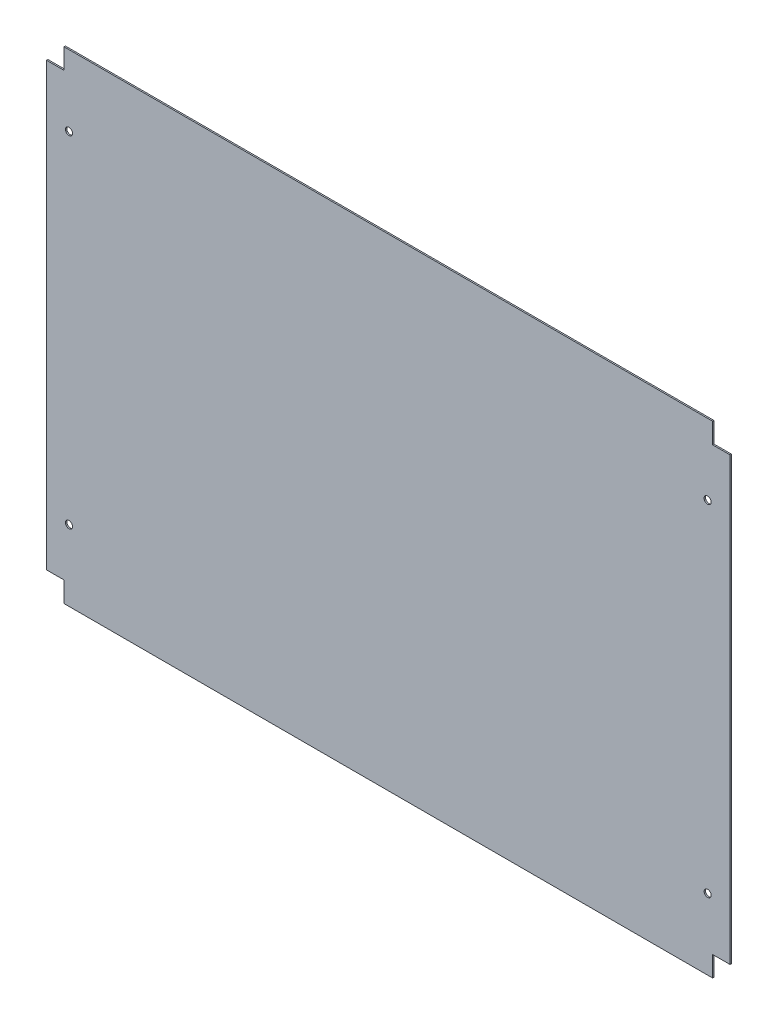
ISO-10303-21;
HEADER;
FILE_DESCRIPTION(('STEP AP214'),'2;1');
FILE_NAME('part.step','',(''),(''),'','','');
FILE_SCHEMA(('AUTOMOTIVE_DESIGN { 1 0 10303 214 1 1 1 1 }'));
ENDSEC;
DATA;
#1=APPLICATION_CONTEXT('core data for automotive mechanical design processes');
#2=APPLICATION_PROTOCOL_DEFINITION('international standard','automotive_design',2000,#1);
#3=PRODUCT_CONTEXT('',#1,'mechanical');
#4=PRODUCT('Part','Part','',(#3));
#5=PRODUCT_RELATED_PRODUCT_CATEGORY('part','',(#4));
#6=PRODUCT_DEFINITION_FORMATION('','',#4);
#7=PRODUCT_DEFINITION_CONTEXT('part definition',#1,'design');
#8=PRODUCT_DEFINITION('design','',#6,#7);
#9=PRODUCT_DEFINITION_SHAPE('','',#8);
#10=(LENGTH_UNIT() NAMED_UNIT(*) SI_UNIT(.MILLI.,.METRE.));
#11=(NAMED_UNIT(*) PLANE_ANGLE_UNIT() SI_UNIT($,.RADIAN.));
#12=(NAMED_UNIT(*) SI_UNIT($,.STERADIAN.) SOLID_ANGLE_UNIT());
#13=UNCERTAINTY_MEASURE_WITH_UNIT(LENGTH_MEASURE(1.E-05),#10,'distance_accuracy_value','');
#14=(GEOMETRIC_REPRESENTATION_CONTEXT(3) GLOBAL_UNCERTAINTY_ASSIGNED_CONTEXT((#13)) GLOBAL_UNIT_ASSIGNED_CONTEXT((#10,
#11,#12)) REPRESENTATION_CONTEXT('',''));
#15=CARTESIAN_POINT('',(0.,0.,0.));
#16=DIRECTION('',(0.,0.,1.));
#17=DIRECTION('',(1.,0.,0.));
#18=AXIS2_PLACEMENT_3D('',#15,#16,#17);
#19=CARTESIAN_POINT('',(0.,0.,-1.524));
#20=DIRECTION('',(0.,0.,-1.));
#21=DIRECTION('',(-1.,0.,0.));
#22=AXIS2_PLACEMENT_3D('',#19,#20,#21);
#23=PLANE('',#22);
#24=CARTESIAN_POINT('',(-357.251,-190.5,-1.524));
#25=DIRECTION('',(0.,0.,-1.));
#26=DIRECTION('',(-1.,0.,0.));
#27=AXIS2_PLACEMENT_3D('',#24,#25,#26);
#28=CIRCLE('',#27,3.9624);
#29=CARTESIAN_POINT('',(-361.2134,-190.5,-1.524));
#30=VERTEX_POINT('',#29);
#31=EDGE_CURVE('E380',#30,#30,#28,.T.);
#32=ORIENTED_EDGE('',*,*,#31,.F.);
#33=EDGE_LOOP('',(#32));
#34=FACE_BOUND('',#33,.T.);
#35=CARTESIAN_POINT('',(357.251,190.5,-1.524));
#36=DIRECTION('',(0.,0.,-1.));
#37=DIRECTION('',(-1.,0.,0.));
#38=AXIS2_PLACEMENT_3D('',#35,#36,#37);
#39=CIRCLE('',#38,3.9624);
#40=CARTESIAN_POINT('',(353.2886,190.5,-1.524));
#41=VERTEX_POINT('',#40);
#42=EDGE_CURVE('E376',#41,#41,#39,.T.);
#43=ORIENTED_EDGE('',*,*,#42,.F.);
#44=EDGE_LOOP('',(#43));
#45=FACE_BOUND('',#44,.T.);
#46=CARTESIAN_POINT('',(357.251,-190.5,-1.524));
#47=DIRECTION('',(0.,0.,-1.));
#48=DIRECTION('',(-1.,0.,0.));
#49=AXIS2_PLACEMENT_3D('',#46,#47,#48);
#50=CIRCLE('',#49,3.9624);
#51=CARTESIAN_POINT('',(353.2886,-190.5,-1.524));
#52=VERTEX_POINT('',#51);
#53=EDGE_CURVE('E372',#52,#52,#50,.T.);
#54=ORIENTED_EDGE('',*,*,#53,.F.);
#55=EDGE_LOOP('',(#54));
#56=FACE_BOUND('',#55,.T.);
#57=CARTESIAN_POINT('',(-357.251,190.5,-1.524));
#58=DIRECTION('',(0.,0.,-1.));
#59=DIRECTION('',(-1.,0.,0.));
#60=AXIS2_PLACEMENT_3D('',#57,#58,#59);
#61=CIRCLE('',#60,3.9624);
#62=CARTESIAN_POINT('',(-361.2134,190.5,-1.524));
#63=VERTEX_POINT('',#62);
#64=EDGE_CURVE('E368',#63,#63,#61,.T.);
#65=ORIENTED_EDGE('',*,*,#64,.F.);
#66=EDGE_LOOP('',(#65));
#67=FACE_BOUND('',#66,.T.);
#68=DIRECTION('',(0.,-1.,0.));
#69=VECTOR('',#68,1.);
#70=CARTESIAN_POINT('',(-362.6866,247.0404,-1.52400000000009));
#71=LINE('',#70,#69);
#72=CARTESIAN_POINT('',(-362.6866,247.0404,-1.524));
#73=VERTEX_POINT('',#72);
#74=CARTESIAN_POINT('',(-362.6866,246.888,-1.524));
#75=VERTEX_POINT('',#74);
#76=EDGE_CURVE('E150',#73,#75,#71,.T.);
#77=ORIENTED_EDGE('',*,*,#76,.F.);
#78=DIRECTION('',(1.,0.,0.));
#79=VECTOR('',#78,1.);
#80=CARTESIAN_POINT('',(-365.887,247.0404,-1.52400000000009));
#81=LINE('',#80,#79);
#82=CARTESIAN_POINT('',(-362.7628,247.0404,-1.524));
#83=VERTEX_POINT('',#82);
#84=EDGE_CURVE('E385',#83,#73,#81,.T.);
#85=ORIENTED_EDGE('',*,*,#84,.F.);
#86=DIRECTION('',(0.,-1.,0.));
#87=VECTOR('',#86,1.);
#88=CARTESIAN_POINT('',(-362.7628,0.,-1.524));
#89=LINE('',#88,#87);
#90=CARTESIAN_POINT('',(-362.7628,269.734962531012,-1.52399999999991));
#91=VERTEX_POINT('',#90);
#92=EDGE_CURVE('E478',#91,#83,#89,.T.);
#93=ORIENTED_EDGE('',*,*,#92,.F.);
#94=DIRECTION('',(-1.,0.,0.));
#95=VECTOR('',#94,1.);
#96=CARTESIAN_POINT('',(0.,269.734962531012,-1.52399999999991));
#97=LINE('',#96,#95);
#98=CARTESIAN_POINT('',(362.7628,269.734962531012,-1.52399999999991));
#99=VERTEX_POINT('',#98);
#100=EDGE_CURVE('E294',#91,#99,#97,.F.);
#101=ORIENTED_EDGE('',*,*,#100,.T.);
#102=DIRECTION('',(0.,1.,0.));
#103=VECTOR('',#102,1.);
#104=CARTESIAN_POINT('',(362.7628,0.,-1.524));
#105=LINE('',#104,#103);
#106=CARTESIAN_POINT('',(362.7628,247.0404,-1.52399999999998));
#107=VERTEX_POINT('',#106);
#108=EDGE_CURVE('E289',#107,#99,#105,.T.);
#109=ORIENTED_EDGE('',*,*,#108,.F.);
#110=DIRECTION('',(1.,0.,0.));
#111=VECTOR('',#110,1.);
#112=CARTESIAN_POINT('',(362.6866,247.0404,-1.52399999999998));
#113=LINE('',#112,#111);
#114=CARTESIAN_POINT('',(362.6866,247.0404,-1.52399999999998));
#115=VERTEX_POINT('',#114);
#116=EDGE_CURVE('E436',#115,#107,#113,.T.);
#117=ORIENTED_EDGE('',*,*,#116,.F.);
#118=DIRECTION('',(0.,1.,0.));
#119=VECTOR('',#118,1.);
#120=CARTESIAN_POINT('',(362.6866,246.888,-1.52399999999998));
#121=LINE('',#120,#119);
#122=CARTESIAN_POINT('',(362.6866,246.888,-1.52399999999998));
#123=VERTEX_POINT('',#122);
#124=EDGE_CURVE('E430',#123,#115,#121,.T.);
#125=ORIENTED_EDGE('',*,*,#124,.F.);
#126=DIRECTION('',(-1.,0.,0.));
#127=VECTOR('',#126,1.);
#128=CARTESIAN_POINT('',(0.,246.888,-1.524));
#129=LINE('',#128,#127);
#130=CARTESIAN_POINT('',(382.383962531012,246.888,-1.52399999999991));
#131=VERTEX_POINT('',#130);
#132=EDGE_CURVE('E496',#131,#123,#129,.T.);
#133=ORIENTED_EDGE('',*,*,#132,.F.);
#134=DIRECTION('',(0.,-1.,0.));
#135=VECTOR('',#134,1.);
#136=CARTESIAN_POINT('',(382.383962531012,0.,-1.52399999999986));
#137=LINE('',#136,#135);
#138=CARTESIAN_POINT('',(382.383962531012,-246.888,-1.5239999999998));
#139=VERTEX_POINT('',#138);
#140=EDGE_CURVE('E310',#131,#139,#137,.T.);
#141=ORIENTED_EDGE('',*,*,#140,.T.);
#142=DIRECTION('',(1.,0.,0.));
#143=VECTOR('',#142,1.);
#144=CARTESIAN_POINT('',(0.,-246.888,-1.524));
#145=LINE('',#144,#143);
#146=CARTESIAN_POINT('',(362.6866,-246.888,-1.524));
#147=VERTEX_POINT('',#146);
#148=EDGE_CURVE('E482',#147,#139,#145,.T.);
#149=ORIENTED_EDGE('',*,*,#148,.F.);
#150=DIRECTION('',(0.,1.,0.));
#151=VECTOR('',#150,1.);
#152=CARTESIAN_POINT('',(362.6866,-247.0404,-1.52399999999991));
#153=LINE('',#152,#151);
#154=CARTESIAN_POINT('',(362.6866,-247.0404,-1.524));
#155=VERTEX_POINT('',#154);
#156=EDGE_CURVE('E425',#155,#147,#153,.T.);
#157=ORIENTED_EDGE('',*,*,#156,.F.);
#158=DIRECTION('',(-1.,0.,0.));
#159=VECTOR('',#158,1.);
#160=CARTESIAN_POINT('',(365.887,-247.0404,-1.52399999999991));
#161=LINE('',#160,#159);
#162=CARTESIAN_POINT('',(362.7628,-247.0404,-1.524));
#163=VERTEX_POINT('',#162);
#164=EDGE_CURVE('E420',#163,#155,#161,.T.);
#165=ORIENTED_EDGE('',*,*,#164,.F.);
#166=DIRECTION('',(0.,1.,0.));
#167=VECTOR('',#166,1.);
#168=CARTESIAN_POINT('',(362.7628,0.,-1.524));
#169=LINE('',#168,#167);
#170=CARTESIAN_POINT('',(362.7628,-269.734962531012,-1.52399999999991));
#171=VERTEX_POINT('',#170);
#172=EDGE_CURVE('E485',#171,#163,#169,.T.);
#173=ORIENTED_EDGE('',*,*,#172,.F.);
#174=DIRECTION('',(-1.,0.,0.));
#175=VECTOR('',#174,1.);
#176=CARTESIAN_POINT('',(0.,-269.734962531012,-1.52399999999991));
#177=LINE('',#176,#175);
#178=CARTESIAN_POINT('',(-362.7628,-269.734962531012,-1.52399999999991));
#179=VERTEX_POINT('',#178);
#180=EDGE_CURVE('E327',#171,#179,#177,.T.);
#181=ORIENTED_EDGE('',*,*,#180,.T.);
#182=DIRECTION('',(0.,-1.,0.));
#183=VECTOR('',#182,1.);
#184=CARTESIAN_POINT('',(-362.762800000002,-3.17124104753935E-12,-1.524));
#185=LINE('',#184,#183);
#186=CARTESIAN_POINT('',(-362.7628,-247.0404,-1.52400000000002));
#187=VERTEX_POINT('',#186);
#188=EDGE_CURVE('E488',#187,#179,#185,.T.);
#189=ORIENTED_EDGE('',*,*,#188,.F.);
#190=DIRECTION('',(-1.,0.,0.));
#191=VECTOR('',#190,1.);
#192=CARTESIAN_POINT('',(-362.6866,-247.0404,-1.52400000000002));
#193=LINE('',#192,#191);
#194=CARTESIAN_POINT('',(-362.6866,-247.0404,-1.52400000000002));
#195=VERTEX_POINT('',#194);
#196=EDGE_CURVE('E398',#195,#187,#193,.T.);
#197=ORIENTED_EDGE('',*,*,#196,.F.);
#198=DIRECTION('',(0.,-1.,0.));
#199=VECTOR('',#198,1.);
#200=CARTESIAN_POINT('',(-362.6866,-246.888,-1.52400000000002));
#201=LINE('',#200,#199);
#202=CARTESIAN_POINT('',(-362.6866,-246.888,-1.52400000000002));
#203=VERTEX_POINT('',#202);
#204=EDGE_CURVE('E392',#203,#195,#201,.T.);
#205=ORIENTED_EDGE('',*,*,#204,.F.);
#206=DIRECTION('',(1.,0.,0.));
#207=VECTOR('',#206,1.);
#208=CARTESIAN_POINT('',(0.,-246.888,-1.524));
#209=LINE('',#208,#207);
#210=CARTESIAN_POINT('',(-382.383962531012,-246.888,-1.52399999999991));
#211=VERTEX_POINT('',#210);
#212=EDGE_CURVE('E491',#211,#203,#209,.T.);
#213=ORIENTED_EDGE('',*,*,#212,.F.);
#214=DIRECTION('',(0.,1.,0.));
#215=VECTOR('',#214,1.);
#216=CARTESIAN_POINT('',(-382.383962531012,0.,-1.52399999999991));
#217=LINE('',#216,#215);
#218=CARTESIAN_POINT('',(-382.383962531012,246.888,-1.52399999999991));
#219=VERTEX_POINT('',#218);
#220=EDGE_CURVE('E343',#211,#219,#217,.T.);
#221=ORIENTED_EDGE('',*,*,#220,.T.);
#222=DIRECTION('',(-1.,0.,0.));
#223=VECTOR('',#222,1.);
#224=CARTESIAN_POINT('',(0.,246.888,-1.524));
#225=LINE('',#224,#223);
#226=EDGE_CURVE('E155',#75,#219,#225,.T.);
#227=ORIENTED_EDGE('',*,*,#226,.F.);
#228=EDGE_LOOP('',(#77,#85,#93,#101,#109,#117,#125,#133,#141,#149,#157,#165,#173,#181,#189,#197,
#205,#213,#221,#227));
#229=FACE_BOUND('',#228,.T.);
#230=ADVANCED_FACE('F134',(#34,#45,#56,#67,#229),#23,.T.);
#231=CARTESIAN_POINT('',(0.,0.,0.));
#232=DIRECTION('',(0.,0.,-1.));
#233=DIRECTION('',(-1.,0.,0.));
#234=AXIS2_PLACEMENT_3D('',#231,#232,#233);
#235=PLANE('',#234);
#236=CARTESIAN_POINT('',(-357.251,-190.5,0.));
#237=DIRECTION('',(0.,0.,1.));
#238=DIRECTION('',(1.,0.,0.));
#239=AXIS2_PLACEMENT_3D('',#236,#237,#238);
#240=CIRCLE('',#239,3.9624);
#241=CARTESIAN_POINT('',(-353.2886,-190.5,0.));
#242=VERTEX_POINT('',#241);
#243=EDGE_CURVE('E357',#242,#242,#240,.T.);
#244=ORIENTED_EDGE('',*,*,#243,.F.);
#245=EDGE_LOOP('',(#244));
#246=FACE_BOUND('',#245,.T.);
#247=CARTESIAN_POINT('',(357.251,190.5,0.));
#248=DIRECTION('',(0.,0.,1.));
#249=DIRECTION('',(1.,0.,0.));
#250=AXIS2_PLACEMENT_3D('',#247,#248,#249);
#251=CIRCLE('',#250,3.9624);
#252=CARTESIAN_POINT('',(361.2134,190.5,0.));
#253=VERTEX_POINT('',#252);
#254=EDGE_CURVE('E356',#253,#253,#251,.T.);
#255=ORIENTED_EDGE('',*,*,#254,.F.);
#256=EDGE_LOOP('',(#255));
#257=FACE_BOUND('',#256,.T.);
#258=CARTESIAN_POINT('',(357.251,-190.5,0.));
#259=DIRECTION('',(0.,0.,1.));
#260=DIRECTION('',(1.,0.,0.));
#261=AXIS2_PLACEMENT_3D('',#258,#259,#260);
#262=CIRCLE('',#261,3.9624);
#263=CARTESIAN_POINT('',(361.2134,-190.5,0.));
#264=VERTEX_POINT('',#263);
#265=EDGE_CURVE('E342',#264,#264,#262,.T.);
#266=ORIENTED_EDGE('',*,*,#265,.F.);
#267=EDGE_LOOP('',(#266));
#268=FACE_BOUND('',#267,.T.);
#269=CARTESIAN_POINT('',(-357.251,190.5,0.));
#270=DIRECTION('',(0.,0.,1.));
#271=DIRECTION('',(1.,0.,0.));
#272=AXIS2_PLACEMENT_3D('',#269,#270,#271);
#273=CIRCLE('',#272,3.9624);
#274=CARTESIAN_POINT('',(-353.2886,190.5,0.));
#275=VERTEX_POINT('',#274);
#276=EDGE_CURVE('E361',#275,#275,#273,.T.);
#277=ORIENTED_EDGE('',*,*,#276,.F.);
#278=EDGE_LOOP('',(#277));
#279=FACE_BOUND('',#278,.T.);
#280=DIRECTION('',(-1.,0.,0.));
#281=VECTOR('',#280,1.);
#282=CARTESIAN_POINT('',(0.,247.0404,0.));
#283=LINE('',#282,#281);
#284=CARTESIAN_POINT('',(-362.6866,247.0404,0.));
#285=VERTEX_POINT('',#284);
#286=CARTESIAN_POINT('',(-362.7628,247.0404,0.));
#287=VERTEX_POINT('',#286);
#288=EDGE_CURVE('E388',#285,#287,#283,.T.);
#289=ORIENTED_EDGE('',*,*,#288,.F.);
#290=DIRECTION('',(0.,1.,0.));
#291=VECTOR('',#290,1.);
#292=CARTESIAN_POINT('',(-362.6866,0.,0.));
#293=LINE('',#292,#291);
#294=CARTESIAN_POINT('',(-362.6866,246.888,0.));
#295=VERTEX_POINT('',#294);
#296=EDGE_CURVE('E13',#295,#285,#293,.T.);
#297=ORIENTED_EDGE('',*,*,#296,.F.);
#298=DIRECTION('',(1.,0.,0.));
#299=VECTOR('',#298,1.);
#300=CARTESIAN_POINT('',(-365.887,246.888,0.));
#301=LINE('',#300,#299);
#302=CARTESIAN_POINT('',(-382.383962531012,246.888,1.11022302462516E-13));
#303=VERTEX_POINT('',#302);
#304=EDGE_CURVE('E282',#303,#295,#301,.T.);
#305=ORIENTED_EDGE('',*,*,#304,.F.);
#306=DIRECTION('',(0.,-1.,0.));
#307=VECTOR('',#306,1.);
#308=CARTESIAN_POINT('',(-382.383962531012,-246.888,1.11022302462516E-13));
#309=LINE('',#308,#307);
#310=CARTESIAN_POINT('',(-382.383962531012,-246.888,1.11022302462516E-13));
#311=VERTEX_POINT('',#310);
#312=EDGE_CURVE('E326',#311,#303,#309,.F.);
#313=ORIENTED_EDGE('',*,*,#312,.F.);
#314=DIRECTION('',(-1.,0.,0.));
#315=VECTOR('',#314,1.);
#316=CARTESIAN_POINT('',(-365.887,-246.888,0.));
#317=LINE('',#316,#315);
#318=CARTESIAN_POINT('',(-362.6866,-246.888,0.));
#319=VERTEX_POINT('',#318);
#320=EDGE_CURVE('E462',#319,#311,#317,.T.);
#321=ORIENTED_EDGE('',*,*,#320,.F.);
#322=DIRECTION('',(0.,1.,0.));
#323=VECTOR('',#322,1.);
#324=CARTESIAN_POINT('',(-362.6866,0.,0.));
#325=LINE('',#324,#323);
#326=CARTESIAN_POINT('',(-362.6866,-247.0404,0.));
#327=VERTEX_POINT('',#326);
#328=EDGE_CURVE('E143',#327,#319,#325,.T.);
#329=ORIENTED_EDGE('',*,*,#328,.F.);
#330=DIRECTION('',(1.,0.,0.));
#331=VECTOR('',#330,1.);
#332=CARTESIAN_POINT('',(0.,-247.0404,0.));
#333=LINE('',#332,#331);
#334=CARTESIAN_POINT('',(-362.7628,-247.0404,0.));
#335=VERTEX_POINT('',#334);
#336=EDGE_CURVE('E416',#335,#327,#333,.T.);
#337=ORIENTED_EDGE('',*,*,#336,.F.);
#338=DIRECTION('',(0.,1.,0.));
#339=VECTOR('',#338,1.);
#340=CARTESIAN_POINT('',(-362.7628,-253.238,0.));
#341=LINE('',#340,#339);
#342=CARTESIAN_POINT('',(-362.7628,-269.734962531012,1.11022302462516E-13));
#343=VERTEX_POINT('',#342);
#344=EDGE_CURVE('E464',#343,#335,#341,.T.);
#345=ORIENTED_EDGE('',*,*,#344,.F.);
#346=DIRECTION('',(1.,0.,0.));
#347=VECTOR('',#346,1.);
#348=CARTESIAN_POINT('',(362.7628,-269.734962531012,1.11022302462516E-13));
#349=LINE('',#348,#347);
#350=CARTESIAN_POINT('',(362.7628,-269.734962531012,1.11022302462516E-13));
#351=VERTEX_POINT('',#350);
#352=EDGE_CURVE('E309',#351,#343,#349,.F.);
#353=ORIENTED_EDGE('',*,*,#352,.F.);
#354=DIRECTION('',(0.,-1.,0.));
#355=VECTOR('',#354,1.);
#356=CARTESIAN_POINT('',(362.7628,-253.238,0.));
#357=LINE('',#356,#355);
#358=CARTESIAN_POINT('',(362.7628,-247.0404,0.));
#359=VERTEX_POINT('',#358);
#360=EDGE_CURVE('E456',#359,#351,#357,.T.);
#361=ORIENTED_EDGE('',*,*,#360,.F.);
#362=DIRECTION('',(1.,0.,0.));
#363=VECTOR('',#362,1.);
#364=CARTESIAN_POINT('',(0.,-247.0404,0.));
#365=LINE('',#364,#363);
#366=CARTESIAN_POINT('',(362.6866,-247.0404,0.));
#367=VERTEX_POINT('',#366);
#368=EDGE_CURVE('E424',#367,#359,#365,.T.);
#369=ORIENTED_EDGE('',*,*,#368,.F.);
#370=DIRECTION('',(0.,-1.,0.));
#371=VECTOR('',#370,1.);
#372=CARTESIAN_POINT('',(362.6866,0.,0.));
#373=LINE('',#372,#371);
#374=CARTESIAN_POINT('',(362.6866,-246.888,0.));
#375=VERTEX_POINT('',#374);
#376=EDGE_CURVE('E510',#375,#367,#373,.T.);
#377=ORIENTED_EDGE('',*,*,#376,.F.);
#378=DIRECTION('',(-1.,0.,0.));
#379=VECTOR('',#378,1.);
#380=CARTESIAN_POINT('',(365.887,-246.888,0.));
#381=LINE('',#380,#379);
#382=CARTESIAN_POINT('',(382.383962531012,-246.888,2.77555756156289E-13));
#383=VERTEX_POINT('',#382);
#384=EDGE_CURVE('E459',#383,#375,#381,.T.);
#385=ORIENTED_EDGE('',*,*,#384,.F.);
#386=DIRECTION('',(0.,1.,0.));
#387=VECTOR('',#386,1.);
#388=CARTESIAN_POINT('',(382.383962531012,246.888,1.11022302462516E-13));
#389=LINE('',#388,#387);
#390=CARTESIAN_POINT('',(382.383962531012,246.888,1.11022302462516E-13));
#391=VERTEX_POINT('',#390);
#392=EDGE_CURVE('E318',#391,#383,#389,.F.);
#393=ORIENTED_EDGE('',*,*,#392,.F.);
#394=DIRECTION('',(1.,0.,0.));
#395=VECTOR('',#394,1.);
#396=CARTESIAN_POINT('',(365.887,246.888,0.));
#397=LINE('',#396,#395);
#398=CARTESIAN_POINT('',(362.6866,246.888,0.));
#399=VERTEX_POINT('',#398);
#400=EDGE_CURVE('E283',#399,#391,#397,.T.);
#401=ORIENTED_EDGE('',*,*,#400,.F.);
#402=DIRECTION('',(0.,-1.,0.));
#403=VECTOR('',#402,1.);
#404=CARTESIAN_POINT('',(362.6866,0.,0.));
#405=LINE('',#404,#403);
#406=CARTESIAN_POINT('',(362.6866,247.0404,0.));
#407=VERTEX_POINT('',#406);
#408=EDGE_CURVE('E506',#407,#399,#405,.T.);
#409=ORIENTED_EDGE('',*,*,#408,.F.);
#410=DIRECTION('',(-1.,0.,0.));
#411=VECTOR('',#410,1.);
#412=CARTESIAN_POINT('',(0.,247.0404,0.));
#413=LINE('',#412,#411);
#414=CARTESIAN_POINT('',(362.7628,247.0404,0.));
#415=VERTEX_POINT('',#414);
#416=EDGE_CURVE('E278',#415,#407,#413,.T.);
#417=ORIENTED_EDGE('',*,*,#416,.F.);
#418=DIRECTION('',(0.,-1.,0.));
#419=VECTOR('',#418,1.);
#420=CARTESIAN_POINT('',(362.7628,253.238,0.));
#421=LINE('',#420,#419);
#422=CARTESIAN_POINT('',(362.7628,269.734962531012,1.11022302462516E-13));
#423=VERTEX_POINT('',#422);
#424=EDGE_CURVE('E272',#423,#415,#421,.T.);
#425=ORIENTED_EDGE('',*,*,#424,.F.);
#426=DIRECTION('',(1.,0.,0.));
#427=VECTOR('',#426,1.);
#428=CARTESIAN_POINT('',(362.7628,269.734962531012,1.11022302462516E-13));
#429=LINE('',#428,#427);
#430=CARTESIAN_POINT('',(-362.7628,269.734962531012,1.11022302462516E-13));
#431=VERTEX_POINT('',#430);
#432=EDGE_CURVE('E276',#431,#423,#429,.T.);
#433=ORIENTED_EDGE('',*,*,#432,.F.);
#434=DIRECTION('',(0.,1.,0.));
#435=VECTOR('',#434,1.);
#436=CARTESIAN_POINT('',(-362.7628,253.238,0.));
#437=LINE('',#436,#435);
#438=EDGE_CURVE('E473',#287,#431,#437,.T.);
#439=ORIENTED_EDGE('',*,*,#438,.F.);
#440=EDGE_LOOP('',(#289,#297,#305,#313,#321,#329,#337,#345,#353,#361,#369,#377,#385,#393,#401,
#409,#417,#425,#433,#439));
#441=FACE_BOUND('',#440,.T.);
#442=ADVANCED_FACE('F136',(#246,#257,#268,#279,#441),#235,.F.);
#443=CARTESIAN_POINT('',(-362.7628,-253.238,-2.54));
#444=DIRECTION('',(1.,0.,0.));
#445=DIRECTION('',(0.,1.,0.));
#446=AXIS2_PLACEMENT_3D('',#443,#444,#445);
#447=PLANE('',#446);
#448=DIRECTION('',(0.,0.,1.));
#449=VECTOR('',#448,1.);
#450=CARTESIAN_POINT('',(-362.7628,-247.0404,-2.54));
#451=LINE('',#450,#449);
#452=EDGE_CURVE('E518',#187,#335,#451,.T.);
#453=ORIENTED_EDGE('',*,*,#452,.F.);
#454=ORIENTED_EDGE('',*,*,#188,.T.);
#455=DIRECTION('',(0.,0.,-1.));
#456=VECTOR('',#455,1.);
#457=CARTESIAN_POINT('',(-362.7628,-269.734962531012,1.11022302462516E-13));
#458=LINE('',#457,#456);
#459=EDGE_CURVE('E331',#343,#179,#458,.T.);
#460=ORIENTED_EDGE('',*,*,#459,.F.);
#461=ORIENTED_EDGE('',*,*,#344,.T.);
#462=EDGE_LOOP('',(#453,#454,#460,#461));
#463=FACE_BOUND('',#462,.T.);
#464=ADVANCED_FACE('F539',(#463),#447,.F.);
#465=CARTESIAN_POINT('',(-362.7628,253.238,-2.54));
#466=DIRECTION('',(1.,0.,0.));
#467=DIRECTION('',(0.,0.,-1.));
#468=AXIS2_PLACEMENT_3D('',#465,#466,#467);
#469=PLANE('',#468);
#470=DIRECTION('',(0.,0.,-1.));
#471=VECTOR('',#470,1.);
#472=CARTESIAN_POINT('',(-362.7628,247.0404,-2.54));
#473=LINE('',#472,#471);
#474=EDGE_CURVE('E514',#287,#83,#473,.T.);
#475=ORIENTED_EDGE('',*,*,#474,.F.);
#476=ORIENTED_EDGE('',*,*,#438,.T.);
#477=DIRECTION('',(0.,0.,-1.));
#478=VECTOR('',#477,1.);
#479=CARTESIAN_POINT('',(-362.7628,269.734962531012,1.11022302462516E-13));
#480=LINE('',#479,#478);
#481=EDGE_CURVE('E299',#431,#91,#480,.T.);
#482=ORIENTED_EDGE('',*,*,#481,.T.);
#483=ORIENTED_EDGE('',*,*,#92,.T.);
#484=EDGE_LOOP('',(#475,#476,#482,#483));
#485=FACE_BOUND('',#484,.T.);
#486=ADVANCED_FACE('F595',(#485),#469,.F.);
#487=CARTESIAN_POINT('',(-365.887,246.888,-2.54));
#488=DIRECTION('',(0.,-1.,0.));
#489=DIRECTION('',(0.,0.,-1.));
#490=AXIS2_PLACEMENT_3D('',#487,#488,#489);
#491=PLANE('',#490);
#492=ORIENTED_EDGE('',*,*,#226,.T.);
#493=DIRECTION('',(0.,0.,-1.));
#494=VECTOR('',#493,1.);
#495=CARTESIAN_POINT('',(-382.383962531012,246.888,1.11022302462516E-13));
#496=LINE('',#495,#494);
#497=EDGE_CURVE('E346',#303,#219,#496,.T.);
#498=ORIENTED_EDGE('',*,*,#497,.F.);
#499=ORIENTED_EDGE('',*,*,#304,.T.);
#500=DIRECTION('',(0.,0.,1.));
#501=VECTOR('',#500,1.);
#502=CARTESIAN_POINT('',(-362.6866,246.888,-1.52400000000009));
#503=LINE('',#502,#501);
#504=EDGE_CURVE('E396',#75,#295,#503,.T.);
#505=ORIENTED_EDGE('',*,*,#504,.F.);
#506=EDGE_LOOP('',(#492,#498,#499,#505));
#507=FACE_BOUND('',#506,.T.);
#508=ADVANCED_FACE('F592',(#507),#491,.F.);
#509=CARTESIAN_POINT('',(-365.887,-246.888,-2.54));
#510=DIRECTION('',(0.,1.,0.));
#511=DIRECTION('',(0.,0.,1.));
#512=AXIS2_PLACEMENT_3D('',#509,#510,#511);
#513=PLANE('',#512);
#514=ORIENTED_EDGE('',*,*,#320,.T.);
#515=DIRECTION('',(0.,0.,-1.));
#516=VECTOR('',#515,1.);
#517=CARTESIAN_POINT('',(-382.383962531012,-246.888,1.11022302462516E-13));
#518=LINE('',#517,#516);
#519=EDGE_CURVE('E338',#311,#211,#518,.T.);
#520=ORIENTED_EDGE('',*,*,#519,.T.);
#521=ORIENTED_EDGE('',*,*,#212,.T.);
#522=DIRECTION('',(0.,0.,1.));
#523=VECTOR('',#522,1.);
#524=CARTESIAN_POINT('',(-362.6866,-246.888,-1.52400000000002));
#525=LINE('',#524,#523);
#526=EDGE_CURVE('E397',#203,#319,#525,.T.);
#527=ORIENTED_EDGE('',*,*,#526,.T.);
#528=EDGE_LOOP('',(#514,#520,#521,#527));
#529=FACE_BOUND('',#528,.T.);
#530=ADVANCED_FACE('F530',(#529),#513,.F.);
#531=CARTESIAN_POINT('',(362.7628,-253.238,-2.54));
#532=DIRECTION('',(-1.,0.,0.));
#533=DIRECTION('',(0.,0.,1.));
#534=AXIS2_PLACEMENT_3D('',#531,#532,#533);
#535=PLANE('',#534);
#536=ORIENTED_EDGE('',*,*,#360,.T.);
#537=DIRECTION('',(0.,0.,-1.));
#538=VECTOR('',#537,1.);
#539=CARTESIAN_POINT('',(362.7628,-269.734962531012,1.11022302462516E-13));
#540=LINE('',#539,#538);
#541=EDGE_CURVE('E322',#351,#171,#540,.T.);
#542=ORIENTED_EDGE('',*,*,#541,.T.);
#543=ORIENTED_EDGE('',*,*,#172,.T.);
#544=DIRECTION('',(0.,0.,-1.));
#545=VECTOR('',#544,1.);
#546=CARTESIAN_POINT('',(362.7628,-247.0404,-2.54));
#547=LINE('',#546,#545);
#548=EDGE_CURVE('E499',#359,#163,#547,.T.);
#549=ORIENTED_EDGE('',*,*,#548,.F.);
#550=EDGE_LOOP('',(#536,#542,#543,#549));
#551=FACE_BOUND('',#550,.T.);
#552=ADVANCED_FACE('F548',(#551),#535,.F.);
#553=CARTESIAN_POINT('',(362.7628,253.238,-2.54));
#554=DIRECTION('',(-1.,0.,0.));
#555=DIRECTION('',(0.,0.,1.));
#556=AXIS2_PLACEMENT_3D('',#553,#554,#555);
#557=PLANE('',#556);
#558=DIRECTION('',(0.,0.,1.));
#559=VECTOR('',#558,1.);
#560=CARTESIAN_POINT('',(362.7628,247.0404,-2.54));
#561=LINE('',#560,#559);
#562=EDGE_CURVE('E503',#107,#415,#561,.T.);
#563=ORIENTED_EDGE('',*,*,#562,.F.);
#564=ORIENTED_EDGE('',*,*,#108,.T.);
#565=DIRECTION('',(0.,0.,-1.));
#566=VECTOR('',#565,1.);
#567=CARTESIAN_POINT('',(362.7628,269.734962531012,1.11022302462516E-13));
#568=LINE('',#567,#566);
#569=EDGE_CURVE('E286',#423,#99,#568,.T.);
#570=ORIENTED_EDGE('',*,*,#569,.F.);
#571=ORIENTED_EDGE('',*,*,#424,.T.);
#572=EDGE_LOOP('',(#563,#564,#570,#571));
#573=FACE_BOUND('',#572,.T.);
#574=ADVANCED_FACE('F287',(#573),#557,.F.);
#575=CARTESIAN_POINT('',(365.887,-246.888,-2.54));
#576=DIRECTION('',(0.,1.,0.));
#577=DIRECTION('',(0.,0.,1.));
#578=AXIS2_PLACEMENT_3D('',#575,#576,#577);
#579=PLANE('',#578);
#580=ORIENTED_EDGE('',*,*,#148,.T.);
#581=DIRECTION('',(0.,0.,-1.));
#582=VECTOR('',#581,1.);
#583=CARTESIAN_POINT('',(382.383962531012,-246.888,2.77555756156289E-13));
#584=LINE('',#583,#582);
#585=EDGE_CURVE('E314',#383,#139,#584,.T.);
#586=ORIENTED_EDGE('',*,*,#585,.F.);
#587=ORIENTED_EDGE('',*,*,#384,.T.);
#588=DIRECTION('',(0.,0.,1.));
#589=VECTOR('',#588,1.);
#590=CARTESIAN_POINT('',(362.6866,-246.888,-1.52399999999991));
#591=LINE('',#590,#589);
#592=EDGE_CURVE('E434',#147,#375,#591,.T.);
#593=ORIENTED_EDGE('',*,*,#592,.F.);
#594=EDGE_LOOP('',(#580,#586,#587,#593));
#595=FACE_BOUND('',#594,.T.);
#596=ADVANCED_FACE('F558',(#595),#579,.F.);
#597=CARTESIAN_POINT('',(365.887,246.888,-2.54));
#598=DIRECTION('',(0.,-1.,0.));
#599=DIRECTION('',(0.,0.,-1.));
#600=AXIS2_PLACEMENT_3D('',#597,#598,#599);
#601=PLANE('',#600);
#602=ORIENTED_EDGE('',*,*,#400,.T.);
#603=DIRECTION('',(0.,0.,-1.));
#604=VECTOR('',#603,1.);
#605=CARTESIAN_POINT('',(382.383962531012,246.888,1.11022302462516E-13));
#606=LINE('',#605,#604);
#607=EDGE_CURVE('E305',#391,#131,#606,.T.);
#608=ORIENTED_EDGE('',*,*,#607,.T.);
#609=ORIENTED_EDGE('',*,*,#132,.T.);
#610=DIRECTION('',(0.,0.,1.));
#611=VECTOR('',#610,1.);
#612=CARTESIAN_POINT('',(362.6866,246.888,-1.52399999999998));
#613=LINE('',#612,#611);
#614=EDGE_CURVE('E435',#123,#399,#613,.T.);
#615=ORIENTED_EDGE('',*,*,#614,.T.);
#616=EDGE_LOOP('',(#602,#608,#609,#615));
#617=FACE_BOUND('',#616,.T.);
#618=ADVANCED_FACE('F566',(#617),#601,.F.);
#619=CARTESIAN_POINT('',(362.6866,247.0404,-1.52399999999998));
#620=DIRECTION('',(0.,-1.,0.));
#621=DIRECTION('',(0.,0.,-1.));
#622=AXIS2_PLACEMENT_3D('',#619,#620,#621);
#623=PLANE('',#622);
#624=ORIENTED_EDGE('',*,*,#562,.T.);
#625=ORIENTED_EDGE('',*,*,#416,.T.);
#626=DIRECTION('',(0.,0.,1.));
#627=VECTOR('',#626,1.);
#628=CARTESIAN_POINT('',(362.6866,247.0404,-1.52399999999998));
#629=LINE('',#628,#627);
#630=EDGE_CURVE('E419',#115,#407,#629,.T.);
#631=ORIENTED_EDGE('',*,*,#630,.F.);
#632=ORIENTED_EDGE('',*,*,#116,.T.);
#633=EDGE_LOOP('',(#624,#625,#631,#632));
#634=FACE_BOUND('',#633,.T.);
#635=ADVANCED_FACE('F573',(#634),#623,.T.);
#636=CARTESIAN_POINT('',(362.6866,246.888,-1.52399999999998));
#637=DIRECTION('',(1.,0.,0.));
#638=DIRECTION('',(0.,0.,-1.));
#639=AXIS2_PLACEMENT_3D('',#636,#637,#638);
#640=PLANE('',#639);
#641=ORIENTED_EDGE('',*,*,#630,.T.);
#642=ORIENTED_EDGE('',*,*,#408,.T.);
#643=ORIENTED_EDGE('',*,*,#614,.F.);
#644=ORIENTED_EDGE('',*,*,#124,.T.);
#645=EDGE_LOOP('',(#641,#642,#643,#644));
#646=FACE_BOUND('',#645,.T.);
#647=ADVANCED_FACE('F570',(#646),#640,.T.);
#648=CARTESIAN_POINT('',(362.6866,-247.0404,-1.52399999999991));
#649=DIRECTION('',(1.,0.,0.));
#650=DIRECTION('',(0.,0.,-1.));
#651=AXIS2_PLACEMENT_3D('',#648,#649,#650);
#652=PLANE('',#651);
#653=ORIENTED_EDGE('',*,*,#592,.T.);
#654=ORIENTED_EDGE('',*,*,#376,.T.);
#655=DIRECTION('',(0.,0.,1.));
#656=VECTOR('',#655,1.);
#657=CARTESIAN_POINT('',(362.6866,-247.0404,-1.52399999999991));
#658=LINE('',#657,#656);
#659=EDGE_CURVE('E429',#155,#367,#658,.T.);
#660=ORIENTED_EDGE('',*,*,#659,.F.);
#661=ORIENTED_EDGE('',*,*,#156,.T.);
#662=EDGE_LOOP('',(#653,#654,#660,#661));
#663=FACE_BOUND('',#662,.T.);
#664=ADVANCED_FACE('F555',(#663),#652,.T.);
#665=CARTESIAN_POINT('',(365.887,-247.0404,-1.52399999999991));
#666=DIRECTION('',(0.,1.,0.));
#667=DIRECTION('',(0.,0.,1.));
#668=AXIS2_PLACEMENT_3D('',#665,#666,#667);
#669=PLANE('',#668);
#670=ORIENTED_EDGE('',*,*,#659,.T.);
#671=ORIENTED_EDGE('',*,*,#368,.T.);
#672=ORIENTED_EDGE('',*,*,#548,.T.);
#673=ORIENTED_EDGE('',*,*,#164,.T.);
#674=EDGE_LOOP('',(#670,#671,#672,#673));
#675=FACE_BOUND('',#674,.T.);
#676=ADVANCED_FACE('F551',(#675),#669,.T.);
#677=CARTESIAN_POINT('',(-362.6866,-247.0404,-1.52400000000002));
#678=DIRECTION('',(0.,1.,0.));
#679=DIRECTION('',(0.,0.,1.));
#680=AXIS2_PLACEMENT_3D('',#677,#678,#679);
#681=PLANE('',#680);
#682=ORIENTED_EDGE('',*,*,#452,.T.);
#683=ORIENTED_EDGE('',*,*,#336,.T.);
#684=DIRECTION('',(0.,0.,1.));
#685=VECTOR('',#684,1.);
#686=CARTESIAN_POINT('',(-362.6866,-247.0404,-1.52400000000002));
#687=LINE('',#686,#685);
#688=EDGE_CURVE('E384',#195,#327,#687,.T.);
#689=ORIENTED_EDGE('',*,*,#688,.F.);
#690=ORIENTED_EDGE('',*,*,#196,.T.);
#691=EDGE_LOOP('',(#682,#683,#689,#690));
#692=FACE_BOUND('',#691,.T.);
#693=ADVANCED_FACE('F537',(#692),#681,.T.);
#694=CARTESIAN_POINT('',(-362.6866,-246.888,-1.52400000000002));
#695=DIRECTION('',(-1.,0.,0.));
#696=DIRECTION('',(0.,0.,1.));
#697=AXIS2_PLACEMENT_3D('',#694,#695,#696);
#698=PLANE('',#697);
#699=ORIENTED_EDGE('',*,*,#688,.T.);
#700=ORIENTED_EDGE('',*,*,#328,.T.);
#701=ORIENTED_EDGE('',*,*,#526,.F.);
#702=ORIENTED_EDGE('',*,*,#204,.T.);
#703=EDGE_LOOP('',(#699,#700,#701,#702));
#704=FACE_BOUND('',#703,.T.);
#705=ADVANCED_FACE('F526',(#704),#698,.T.);
#706=CARTESIAN_POINT('',(-362.6866,247.0404,-1.52400000000009));
#707=DIRECTION('',(-1.,0.,0.));
#708=DIRECTION('',(0.,0.,1.));
#709=AXIS2_PLACEMENT_3D('',#706,#707,#708);
#710=PLANE('',#709);
#711=ORIENTED_EDGE('',*,*,#504,.T.);
#712=ORIENTED_EDGE('',*,*,#296,.T.);
#713=DIRECTION('',(0.,0.,1.));
#714=VECTOR('',#713,1.);
#715=CARTESIAN_POINT('',(-362.6866,247.0404,-1.52400000000009));
#716=LINE('',#715,#714);
#717=EDGE_CURVE('E391',#73,#285,#716,.T.);
#718=ORIENTED_EDGE('',*,*,#717,.F.);
#719=ORIENTED_EDGE('',*,*,#76,.T.);
#720=EDGE_LOOP('',(#711,#712,#718,#719));
#721=FACE_BOUND('',#720,.T.);
#722=ADVANCED_FACE('F636',(#721),#710,.T.);
#723=CARTESIAN_POINT('',(-365.887,247.0404,-1.52400000000009));
#724=DIRECTION('',(0.,-1.,0.));
#725=DIRECTION('',(0.,0.,-1.));
#726=AXIS2_PLACEMENT_3D('',#723,#724,#725);
#727=PLANE('',#726);
#728=ORIENTED_EDGE('',*,*,#717,.T.);
#729=ORIENTED_EDGE('',*,*,#288,.T.);
#730=ORIENTED_EDGE('',*,*,#474,.T.);
#731=ORIENTED_EDGE('',*,*,#84,.T.);
#732=EDGE_LOOP('',(#728,#729,#730,#731));
#733=FACE_BOUND('',#732,.T.);
#734=ADVANCED_FACE('F644',(#733),#727,.T.);
#735=CARTESIAN_POINT('',(-357.251,190.5,-19.05));
#736=DIRECTION('',(0.,0.,1.));
#737=DIRECTION('',(1.,0.,0.));
#738=AXIS2_PLACEMENT_3D('',#735,#736,#737);
#739=CYLINDRICAL_SURFACE('',#738,3.9624);
#740=ORIENTED_EDGE('',*,*,#64,.T.);
#741=EDGE_LOOP('',(#740));
#742=FACE_BOUND('',#741,.T.);
#743=ORIENTED_EDGE('',*,*,#276,.T.);
#744=EDGE_LOOP('',(#743));
#745=FACE_BOUND('',#744,.T.);
#746=ADVANCED_FACE('F653',(#742,#745),#739,.F.);
#747=CARTESIAN_POINT('',(357.251,-190.5,-19.05));
#748=DIRECTION('',(0.,0.,1.));
#749=DIRECTION('',(1.,0.,0.));
#750=AXIS2_PLACEMENT_3D('',#747,#748,#749);
#751=CYLINDRICAL_SURFACE('',#750,3.9624);
#752=ORIENTED_EDGE('',*,*,#53,.T.);
#753=EDGE_LOOP('',(#752));
#754=FACE_BOUND('',#753,.T.);
#755=ORIENTED_EDGE('',*,*,#265,.T.);
#756=EDGE_LOOP('',(#755));
#757=FACE_BOUND('',#756,.T.);
#758=ADVANCED_FACE('F661',(#754,#757),#751,.F.);
#759=CARTESIAN_POINT('',(357.251,190.5,-19.05));
#760=DIRECTION('',(0.,0.,1.));
#761=DIRECTION('',(1.,0.,0.));
#762=AXIS2_PLACEMENT_3D('',#759,#760,#761);
#763=CYLINDRICAL_SURFACE('',#762,3.9624);
#764=ORIENTED_EDGE('',*,*,#42,.T.);
#765=EDGE_LOOP('',(#764));
#766=FACE_BOUND('',#765,.T.);
#767=ORIENTED_EDGE('',*,*,#254,.T.);
#768=EDGE_LOOP('',(#767));
#769=FACE_BOUND('',#768,.T.);
#770=ADVANCED_FACE('F670',(#766,#769),#763,.F.);
#771=CARTESIAN_POINT('',(-357.251,-190.5,-19.05));
#772=DIRECTION('',(0.,0.,1.));
#773=DIRECTION('',(1.,0.,0.));
#774=AXIS2_PLACEMENT_3D('',#771,#772,#773);
#775=CYLINDRICAL_SURFACE('',#774,3.9624);
#776=ORIENTED_EDGE('',*,*,#31,.T.);
#777=EDGE_LOOP('',(#776));
#778=FACE_BOUND('',#777,.T.);
#779=ORIENTED_EDGE('',*,*,#243,.T.);
#780=EDGE_LOOP('',(#779));
#781=FACE_BOUND('',#780,.T.);
#782=ADVANCED_FACE('F679',(#778,#781),#775,.F.);
#783=CARTESIAN_POINT('',(-382.383962531012,-246.888,1.11022302462516E-13));
#784=DIRECTION('',(-1.,0.,0.));
#785=DIRECTION('',(0.,0.,1.));
#786=AXIS2_PLACEMENT_3D('',#783,#784,#785);
#787=PLANE('',#786);
#788=ORIENTED_EDGE('',*,*,#220,.F.);
#789=ORIENTED_EDGE('',*,*,#519,.F.);
#790=ORIENTED_EDGE('',*,*,#312,.T.);
#791=ORIENTED_EDGE('',*,*,#497,.T.);
#792=EDGE_LOOP('',(#788,#789,#790,#791));
#793=FACE_BOUND('',#792,.T.);
#794=ADVANCED_FACE('F688',(#793),#787,.T.);
#795=CARTESIAN_POINT('',(362.7628,-269.734962531012,1.11022302462516E-13));
#796=DIRECTION('',(0.,-1.,0.));
#797=DIRECTION('',(0.,0.,-1.));
#798=AXIS2_PLACEMENT_3D('',#795,#796,#797);
#799=PLANE('',#798);
#800=ORIENTED_EDGE('',*,*,#180,.F.);
#801=ORIENTED_EDGE('',*,*,#541,.F.);
#802=ORIENTED_EDGE('',*,*,#352,.T.);
#803=ORIENTED_EDGE('',*,*,#459,.T.);
#804=EDGE_LOOP('',(#800,#801,#802,#803));
#805=FACE_BOUND('',#804,.T.);
#806=ADVANCED_FACE('F546',(#805),#799,.T.);
#807=CARTESIAN_POINT('',(382.383962531012,246.888,1.11022302462516E-13));
#808=DIRECTION('',(1.,0.,0.));
#809=DIRECTION('',(0.,0.,-1.));
#810=AXIS2_PLACEMENT_3D('',#807,#808,#809);
#811=PLANE('',#810);
#812=ORIENTED_EDGE('',*,*,#140,.F.);
#813=ORIENTED_EDGE('',*,*,#607,.F.);
#814=ORIENTED_EDGE('',*,*,#392,.T.);
#815=ORIENTED_EDGE('',*,*,#585,.T.);
#816=EDGE_LOOP('',(#812,#813,#814,#815));
#817=FACE_BOUND('',#816,.T.);
#818=ADVANCED_FACE('F564',(#817),#811,.T.);
#819=CARTESIAN_POINT('',(362.7628,269.734962531012,1.11022302462516E-13));
#820=DIRECTION('',(0.,1.,0.));
#821=DIRECTION('',(0.,0.,1.));
#822=AXIS2_PLACEMENT_3D('',#819,#820,#821);
#823=PLANE('',#822);
#824=ORIENTED_EDGE('',*,*,#100,.F.);
#825=ORIENTED_EDGE('',*,*,#481,.F.);
#826=ORIENTED_EDGE('',*,*,#432,.T.);
#827=ORIENTED_EDGE('',*,*,#569,.T.);
#828=EDGE_LOOP('',(#824,#825,#826,#827));
#829=FACE_BOUND('',#828,.T.);
#830=ADVANCED_FACE('F297',(#829),#823,.T.);
#831=CLOSED_SHELL('',(#230,#442,#464,#486,#508,#530,#552,#574,#596,#618,#635,#647,#664,#676,
#693,#705,#722,#734,#746,#758,#770,#782,#794,#806,#818,#830));
#832=MANIFOLD_SOLID_BREP('B2',#831);
#833=ADVANCED_BREP_SHAPE_REPRESENTATION('',(#18,#832),#14);
#834=SHAPE_DEFINITION_REPRESENTATION(#9,#833);
ENDSEC;
END-ISO-10303-21;
